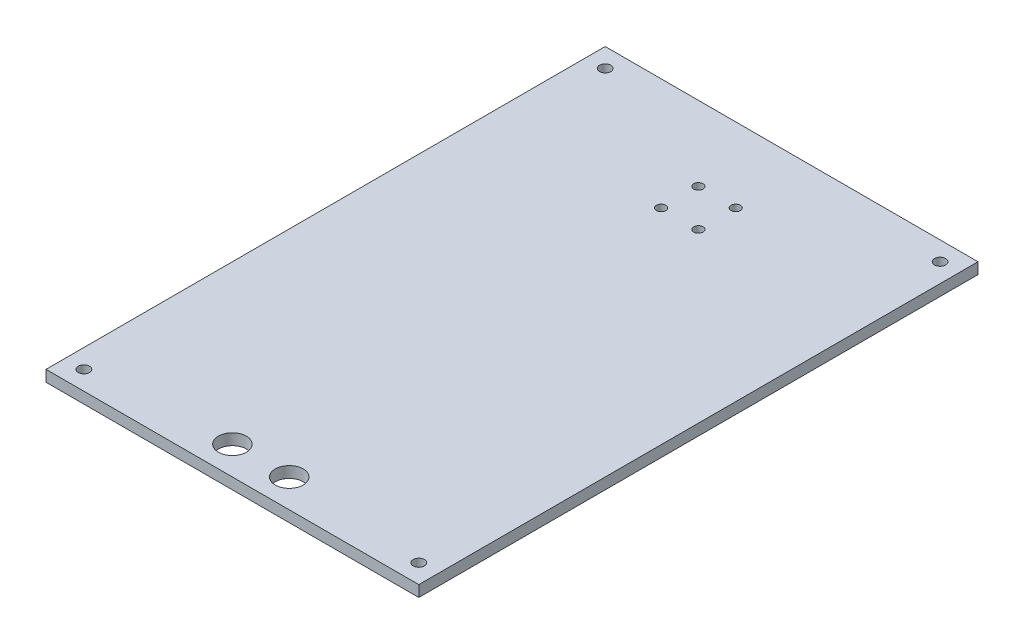
ISO-10303-21;
HEADER;
FILE_DESCRIPTION(('STEP AP214'),'2;1');
FILE_NAME('part.step','',(''),(''),'','','');
FILE_SCHEMA(('AUTOMOTIVE_DESIGN { 1 0 10303 214 1 1 1 1 }'));
ENDSEC;
DATA;
#1=APPLICATION_CONTEXT('core data for automotive mechanical design processes');
#2=APPLICATION_PROTOCOL_DEFINITION('international standard','automotive_design',2000,#1);
#3=PRODUCT_CONTEXT('',#1,'mechanical');
#4=PRODUCT('Part','Part','',(#3));
#5=PRODUCT_RELATED_PRODUCT_CATEGORY('part','',(#4));
#6=PRODUCT_DEFINITION_FORMATION('','',#4);
#7=PRODUCT_DEFINITION_CONTEXT('part definition',#1,'design');
#8=PRODUCT_DEFINITION('design','',#6,#7);
#9=PRODUCT_DEFINITION_SHAPE('','',#8);
#10=(LENGTH_UNIT() NAMED_UNIT(*) SI_UNIT(.MILLI.,.METRE.));
#11=(NAMED_UNIT(*) PLANE_ANGLE_UNIT() SI_UNIT($,.RADIAN.));
#12=(NAMED_UNIT(*) SI_UNIT($,.STERADIAN.) SOLID_ANGLE_UNIT());
#13=UNCERTAINTY_MEASURE_WITH_UNIT(LENGTH_MEASURE(1.E-05),#10,'distance_accuracy_value','');
#14=(GEOMETRIC_REPRESENTATION_CONTEXT(3) GLOBAL_UNCERTAINTY_ASSIGNED_CONTEXT((#13)) GLOBAL_UNIT_ASSIGNED_CONTEXT((#10,
#11,#12)) REPRESENTATION_CONTEXT('',''));
#15=CARTESIAN_POINT('',(0.,0.,0.));
#16=DIRECTION('',(0.,0.,1.));
#17=DIRECTION('',(1.,0.,0.));
#18=AXIS2_PLACEMENT_3D('',#15,#16,#17);
#19=CARTESIAN_POINT('',(49.999999949,3.,74.999999987));
#20=DIRECTION('',(-1.,0.,0.));
#21=DIRECTION('',(0.,0.,1.));
#22=AXIS2_PLACEMENT_3D('',#19,#20,#21);
#23=PLANE('',#22);
#24=DIRECTION('',(0.,0.,-1.));
#25=VECTOR('',#24,1.);
#26=CARTESIAN_POINT('',(49.999999949,0.,74.999999987));
#27=LINE('',#26,#25);
#28=CARTESIAN_POINT('',(49.999999949,0.,74.999999987));
#29=VERTEX_POINT('',#28);
#30=CARTESIAN_POINT('',(49.999999949,0.,-74.999999987));
#31=VERTEX_POINT('',#30);
#32=EDGE_CURVE('E96',#29,#31,#27,.T.);
#33=ORIENTED_EDGE('',*,*,#32,.T.);
#34=DIRECTION('',(0.,-1.,0.));
#35=VECTOR('',#34,1.);
#36=CARTESIAN_POINT('',(49.999999949,3.,-74.999999987));
#37=LINE('',#36,#35);
#38=CARTESIAN_POINT('',(49.999999949,3.,-74.999999987));
#39=VERTEX_POINT('',#38);
#40=EDGE_CURVE('E11',#39,#31,#37,.T.);
#41=ORIENTED_EDGE('',*,*,#40,.F.);
#42=DIRECTION('',(0.,0.,-1.));
#43=VECTOR('',#42,1.);
#44=CARTESIAN_POINT('',(49.999999949,3.,74.999999987));
#45=LINE('',#44,#43);
#46=CARTESIAN_POINT('',(49.999999949,3.,74.999999987));
#47=VERTEX_POINT('',#46);
#48=EDGE_CURVE('E84',#47,#39,#45,.T.);
#49=ORIENTED_EDGE('',*,*,#48,.F.);
#50=DIRECTION('',(0.,-1.,0.));
#51=VECTOR('',#50,1.);
#52=CARTESIAN_POINT('',(49.999999949,3.,74.999999987));
#53=LINE('',#52,#51);
#54=EDGE_CURVE('E92',#47,#29,#53,.T.);
#55=ORIENTED_EDGE('',*,*,#54,.T.);
#56=EDGE_LOOP('',(#33,#41,#49,#55));
#57=FACE_BOUND('',#56,.T.);
#58=ADVANCED_FACE('F33',(#57),#23,.F.);
#59=CARTESIAN_POINT('',(-49.999999949,3.,-74.999999987));
#60=DIRECTION('',(0.,0.,1.));
#61=DIRECTION('',(1.,0.,0.));
#62=AXIS2_PLACEMENT_3D('',#59,#60,#61);
#63=PLANE('',#62);
#64=DIRECTION('',(-1.,0.,0.));
#65=VECTOR('',#64,1.);
#66=CARTESIAN_POINT('',(-49.999999949,0.,-74.999999987));
#67=LINE('',#66,#65);
#68=CARTESIAN_POINT('',(-49.999999949,0.,-74.999999987));
#69=VERTEX_POINT('',#68);
#70=EDGE_CURVE('E88',#31,#69,#67,.T.);
#71=ORIENTED_EDGE('',*,*,#70,.T.);
#72=DIRECTION('',(0.,-1.,0.));
#73=VECTOR('',#72,1.);
#74=CARTESIAN_POINT('',(-49.999999949,3.,-74.999999987));
#75=LINE('',#74,#73);
#76=CARTESIAN_POINT('',(-49.999999949,3.,-74.999999987));
#77=VERTEX_POINT('',#76);
#78=EDGE_CURVE('E41',#77,#69,#75,.T.);
#79=ORIENTED_EDGE('',*,*,#78,.F.);
#80=DIRECTION('',(-1.,0.,0.));
#81=VECTOR('',#80,1.);
#82=CARTESIAN_POINT('',(-49.999999949,3.,-74.999999987));
#83=LINE('',#82,#81);
#84=EDGE_CURVE('E79',#39,#77,#83,.T.);
#85=ORIENTED_EDGE('',*,*,#84,.F.);
#86=ORIENTED_EDGE('',*,*,#40,.T.);
#87=EDGE_LOOP('',(#71,#79,#85,#86));
#88=FACE_BOUND('',#87,.T.);
#89=ADVANCED_FACE('F87',(#88),#63,.F.);
#90=CARTESIAN_POINT('',(-49.999999949,3.,74.999999987));
#91=DIRECTION('',(1.,0.,0.));
#92=DIRECTION('',(0.,0.,-1.));
#93=AXIS2_PLACEMENT_3D('',#90,#91,#92);
#94=PLANE('',#93);
#95=DIRECTION('',(0.,0.,1.));
#96=VECTOR('',#95,1.);
#97=CARTESIAN_POINT('',(-49.999999949,0.,74.999999987));
#98=LINE('',#97,#96);
#99=CARTESIAN_POINT('',(-49.999999949,0.,74.999999987));
#100=VERTEX_POINT('',#99);
#101=EDGE_CURVE('E66',#69,#100,#98,.T.);
#102=ORIENTED_EDGE('',*,*,#101,.T.);
#103=DIRECTION('',(0.,-1.,0.));
#104=VECTOR('',#103,1.);
#105=CARTESIAN_POINT('',(-49.999999949,3.,74.999999987));
#106=LINE('',#105,#104);
#107=CARTESIAN_POINT('',(-49.999999949,3.,74.999999987));
#108=VERTEX_POINT('',#107);
#109=EDGE_CURVE('E89',#108,#100,#106,.T.);
#110=ORIENTED_EDGE('',*,*,#109,.F.);
#111=DIRECTION('',(0.,0.,1.));
#112=VECTOR('',#111,1.);
#113=CARTESIAN_POINT('',(-49.999999949,3.,74.999999987));
#114=LINE('',#113,#112);
#115=EDGE_CURVE('E82',#77,#108,#114,.T.);
#116=ORIENTED_EDGE('',*,*,#115,.F.);
#117=ORIENTED_EDGE('',*,*,#78,.T.);
#118=EDGE_LOOP('',(#102,#110,#116,#117));
#119=FACE_BOUND('',#118,.T.);
#120=ADVANCED_FACE('F90',(#119),#94,.F.);
#121=CARTESIAN_POINT('',(-49.999999949,3.,74.999999987));
#122=DIRECTION('',(0.,0.,-1.));
#123=DIRECTION('',(-1.,0.,0.));
#124=AXIS2_PLACEMENT_3D('',#121,#122,#123);
#125=PLANE('',#124);
#126=DIRECTION('',(1.,0.,0.));
#127=VECTOR('',#126,1.);
#128=CARTESIAN_POINT('',(-49.999999949,0.,74.999999987));
#129=LINE('',#128,#127);
#130=EDGE_CURVE('E72',#100,#29,#129,.T.);
#131=ORIENTED_EDGE('',*,*,#130,.T.);
#132=ORIENTED_EDGE('',*,*,#54,.F.);
#133=DIRECTION('',(1.,0.,0.));
#134=VECTOR('',#133,1.);
#135=CARTESIAN_POINT('',(-49.999999949,3.,74.999999987));
#136=LINE('',#135,#134);
#137=EDGE_CURVE('E49',#108,#47,#136,.T.);
#138=ORIENTED_EDGE('',*,*,#137,.F.);
#139=ORIENTED_EDGE('',*,*,#109,.T.);
#140=EDGE_LOOP('',(#131,#132,#138,#139));
#141=FACE_BOUND('',#140,.T.);
#142=ADVANCED_FACE('F104',(#141),#125,.F.);
#143=CARTESIAN_POINT('',(0.,3.,0.));
#144=DIRECTION('',(0.,-1.,0.));
#145=DIRECTION('',(0.,0.,-1.));
#146=AXIS2_PLACEMENT_3D('',#143,#144,#145);
#147=PLANE('',#146);
#148=CARTESIAN_POINT('',(4.999999906,3.,-45.000000109));
#149=DIRECTION('',(0.,1.,0.));
#150=DIRECTION('',(0.,0.,1.));
#151=AXIS2_PLACEMENT_3D('',#148,#149,#150);
#152=CIRCLE('',#151,1.25);
#153=CARTESIAN_POINT('',(4.999999906,3.,-43.750000109));
#154=VERTEX_POINT('',#153);
#155=EDGE_CURVE('E164',#154,#154,#152,.T.);
#156=ORIENTED_EDGE('',*,*,#155,.F.);
#157=EDGE_LOOP('',(#156));
#158=FACE_BOUND('',#157,.T.);
#159=CARTESIAN_POINT('',(-4.999999906,3.,-45.000000109));
#160=DIRECTION('',(0.,1.,0.));
#161=DIRECTION('',(0.,0.,1.));
#162=AXIS2_PLACEMENT_3D('',#159,#160,#161);
#163=CIRCLE('',#162,1.25);
#164=CARTESIAN_POINT('',(-4.999999906,3.,-43.750000109));
#165=VERTEX_POINT('',#164);
#166=EDGE_CURVE('E158',#165,#165,#163,.T.);
#167=ORIENTED_EDGE('',*,*,#166,.F.);
#168=EDGE_LOOP('',(#167));
#169=FACE_BOUND('',#168,.T.);
#170=CARTESIAN_POINT('',(4.999999906,3.,-55.000000109));
#171=DIRECTION('',(0.,1.,0.));
#172=DIRECTION('',(0.,0.,1.));
#173=AXIS2_PLACEMENT_3D('',#170,#171,#172);
#174=CIRCLE('',#173,1.25);
#175=CARTESIAN_POINT('',(4.999999906,3.,-53.750000109));
#176=VERTEX_POINT('',#175);
#177=EDGE_CURVE('E152',#176,#176,#174,.T.);
#178=ORIENTED_EDGE('',*,*,#177,.F.);
#179=EDGE_LOOP('',(#178));
#180=FACE_BOUND('',#179,.T.);
#181=CARTESIAN_POINT('',(-4.999999906,3.,-55.000000109));
#182=DIRECTION('',(0.,1.,0.));
#183=DIRECTION('',(0.,0.,1.));
#184=AXIS2_PLACEMENT_3D('',#181,#182,#183);
#185=CIRCLE('',#184,1.25);
#186=CARTESIAN_POINT('',(-4.999999906,3.,-53.750000109));
#187=VERTEX_POINT('',#186);
#188=EDGE_CURVE('E146',#187,#187,#185,.T.);
#189=ORIENTED_EDGE('',*,*,#188,.F.);
#190=EDGE_LOOP('',(#189));
#191=FACE_BOUND('',#190,.T.);
#192=CARTESIAN_POINT('',(44.919999949,3.,69.919999987));
#193=DIRECTION('',(0.,1.,0.));
#194=DIRECTION('',(0.,0.,1.));
#195=AXIS2_PLACEMENT_3D('',#192,#193,#194);
#196=CIRCLE('',#195,1.5);
#197=CARTESIAN_POINT('',(44.919999949,3.,71.419999987));
#198=VERTEX_POINT('',#197);
#199=EDGE_CURVE('E140',#198,#198,#196,.T.);
#200=ORIENTED_EDGE('',*,*,#199,.F.);
#201=EDGE_LOOP('',(#200));
#202=FACE_BOUND('',#201,.T.);
#203=CARTESIAN_POINT('',(-44.919999949,3.,69.919999987));
#204=DIRECTION('',(0.,1.,0.));
#205=DIRECTION('',(0.,0.,1.));
#206=AXIS2_PLACEMENT_3D('',#203,#204,#205);
#207=CIRCLE('',#206,1.5);
#208=CARTESIAN_POINT('',(-44.919999949,3.,71.419999987));
#209=VERTEX_POINT('',#208);
#210=EDGE_CURVE('E134',#209,#209,#207,.T.);
#211=ORIENTED_EDGE('',*,*,#210,.F.);
#212=EDGE_LOOP('',(#211));
#213=FACE_BOUND('',#212,.T.);
#214=CARTESIAN_POINT('',(44.919999949,3.,-69.919999987));
#215=DIRECTION('',(0.,1.,0.));
#216=DIRECTION('',(0.,0.,1.));
#217=AXIS2_PLACEMENT_3D('',#214,#215,#216);
#218=CIRCLE('',#217,1.5);
#219=CARTESIAN_POINT('',(44.919999949,3.,-68.419999987));
#220=VERTEX_POINT('',#219);
#221=EDGE_CURVE('E128',#220,#220,#218,.T.);
#222=ORIENTED_EDGE('',*,*,#221,.F.);
#223=EDGE_LOOP('',(#222));
#224=FACE_BOUND('',#223,.T.);
#225=CARTESIAN_POINT('',(-44.919999949,3.,-69.919999987));
#226=DIRECTION('',(0.,1.,0.));
#227=DIRECTION('',(0.,0.,1.));
#228=AXIS2_PLACEMENT_3D('',#225,#226,#227);
#229=CIRCLE('',#228,1.500000048);
#230=CARTESIAN_POINT('',(-44.919999949,3.,-68.419999939));
#231=VERTEX_POINT('',#230);
#232=EDGE_CURVE('E122',#231,#231,#229,.T.);
#233=ORIENTED_EDGE('',*,*,#232,.F.);
#234=EDGE_LOOP('',(#233));
#235=FACE_BOUND('',#234,.T.);
#236=CARTESIAN_POINT('',(7.62000000000002,3.,67.379999987));
#237=DIRECTION('',(0.,1.,0.));
#238=DIRECTION('',(0.,0.,1.));
#239=AXIS2_PLACEMENT_3D('',#236,#237,#238);
#240=CIRCLE('',#239,3.749999993);
#241=CARTESIAN_POINT('',(7.62000000000002,3.,71.12999998));
#242=VERTEX_POINT('',#241);
#243=EDGE_CURVE('E116',#242,#242,#240,.T.);
#244=ORIENTED_EDGE('',*,*,#243,.F.);
#245=EDGE_LOOP('',(#244));
#246=FACE_BOUND('',#245,.T.);
#247=CARTESIAN_POINT('',(-7.61999999999998,3.,67.379999987));
#248=DIRECTION('',(0.,1.,0.));
#249=DIRECTION('',(0.,0.,1.));
#250=AXIS2_PLACEMENT_3D('',#247,#248,#249);
#251=CIRCLE('',#250,3.749999993);
#252=CARTESIAN_POINT('',(-7.61999999999998,3.,71.12999998));
#253=VERTEX_POINT('',#252);
#254=EDGE_CURVE('E110',#253,#253,#251,.T.);
#255=ORIENTED_EDGE('',*,*,#254,.F.);
#256=EDGE_LOOP('',(#255));
#257=FACE_BOUND('',#256,.T.);
#258=ORIENTED_EDGE('',*,*,#48,.T.);
#259=ORIENTED_EDGE('',*,*,#84,.T.);
#260=ORIENTED_EDGE('',*,*,#115,.T.);
#261=ORIENTED_EDGE('',*,*,#137,.T.);
#262=EDGE_LOOP('',(#258,#259,#260,#261));
#263=FACE_BOUND('',#262,.T.);
#264=ADVANCED_FACE('F80',(#158,#169,#180,#191,#202,#213,#224,#235,#246,#257,#263),#147,.F.);
#265=CARTESIAN_POINT('',(0.,0.,0.));
#266=DIRECTION('',(0.,-1.,0.));
#267=DIRECTION('',(0.,0.,-1.));
#268=AXIS2_PLACEMENT_3D('',#265,#266,#267);
#269=PLANE('',#268);
#270=CARTESIAN_POINT('',(4.999999906,0.,-45.000000109));
#271=DIRECTION('',(0.,1.,0.));
#272=DIRECTION('',(0.,0.,1.));
#273=AXIS2_PLACEMENT_3D('',#270,#271,#272);
#274=CIRCLE('',#273,1.25);
#275=CARTESIAN_POINT('',(4.999999906,0.,-43.750000109));
#276=VERTEX_POINT('',#275);
#277=EDGE_CURVE('E161',#276,#276,#274,.T.);
#278=ORIENTED_EDGE('',*,*,#277,.T.);
#279=EDGE_LOOP('',(#278));
#280=FACE_BOUND('',#279,.T.);
#281=CARTESIAN_POINT('',(-4.999999906,0.,-45.000000109));
#282=DIRECTION('',(0.,1.,0.));
#283=DIRECTION('',(0.,0.,1.));
#284=AXIS2_PLACEMENT_3D('',#281,#282,#283);
#285=CIRCLE('',#284,1.25);
#286=CARTESIAN_POINT('',(-4.999999906,0.,-43.750000109));
#287=VERTEX_POINT('',#286);
#288=EDGE_CURVE('E155',#287,#287,#285,.T.);
#289=ORIENTED_EDGE('',*,*,#288,.T.);
#290=EDGE_LOOP('',(#289));
#291=FACE_BOUND('',#290,.T.);
#292=CARTESIAN_POINT('',(4.999999906,0.,-55.000000109));
#293=DIRECTION('',(0.,1.,0.));
#294=DIRECTION('',(0.,0.,1.));
#295=AXIS2_PLACEMENT_3D('',#292,#293,#294);
#296=CIRCLE('',#295,1.25);
#297=CARTESIAN_POINT('',(4.999999906,0.,-53.750000109));
#298=VERTEX_POINT('',#297);
#299=EDGE_CURVE('E149',#298,#298,#296,.T.);
#300=ORIENTED_EDGE('',*,*,#299,.T.);
#301=EDGE_LOOP('',(#300));
#302=FACE_BOUND('',#301,.T.);
#303=CARTESIAN_POINT('',(-4.999999906,0.,-55.000000109));
#304=DIRECTION('',(0.,1.,0.));
#305=DIRECTION('',(0.,0.,1.));
#306=AXIS2_PLACEMENT_3D('',#303,#304,#305);
#307=CIRCLE('',#306,1.25);
#308=CARTESIAN_POINT('',(-4.999999906,0.,-53.750000109));
#309=VERTEX_POINT('',#308);
#310=EDGE_CURVE('E143',#309,#309,#307,.T.);
#311=ORIENTED_EDGE('',*,*,#310,.T.);
#312=EDGE_LOOP('',(#311));
#313=FACE_BOUND('',#312,.T.);
#314=CARTESIAN_POINT('',(44.919999949,0.,69.919999987));
#315=DIRECTION('',(0.,1.,0.));
#316=DIRECTION('',(0.,0.,1.));
#317=AXIS2_PLACEMENT_3D('',#314,#315,#316);
#318=CIRCLE('',#317,1.5);
#319=CARTESIAN_POINT('',(44.919999949,0.,71.419999987));
#320=VERTEX_POINT('',#319);
#321=EDGE_CURVE('E137',#320,#320,#318,.T.);
#322=ORIENTED_EDGE('',*,*,#321,.T.);
#323=EDGE_LOOP('',(#322));
#324=FACE_BOUND('',#323,.T.);
#325=CARTESIAN_POINT('',(-44.919999949,0.,69.919999987));
#326=DIRECTION('',(0.,1.,0.));
#327=DIRECTION('',(0.,0.,1.));
#328=AXIS2_PLACEMENT_3D('',#325,#326,#327);
#329=CIRCLE('',#328,1.5);
#330=CARTESIAN_POINT('',(-44.919999949,0.,71.419999987));
#331=VERTEX_POINT('',#330);
#332=EDGE_CURVE('E131',#331,#331,#329,.T.);
#333=ORIENTED_EDGE('',*,*,#332,.T.);
#334=EDGE_LOOP('',(#333));
#335=FACE_BOUND('',#334,.T.);
#336=CARTESIAN_POINT('',(44.919999949,0.,-69.919999987));
#337=DIRECTION('',(0.,1.,0.));
#338=DIRECTION('',(0.,0.,1.));
#339=AXIS2_PLACEMENT_3D('',#336,#337,#338);
#340=CIRCLE('',#339,1.5);
#341=CARTESIAN_POINT('',(44.919999949,0.,-68.419999987));
#342=VERTEX_POINT('',#341);
#343=EDGE_CURVE('E125',#342,#342,#340,.T.);
#344=ORIENTED_EDGE('',*,*,#343,.T.);
#345=EDGE_LOOP('',(#344));
#346=FACE_BOUND('',#345,.T.);
#347=CARTESIAN_POINT('',(-44.919999949,0.,-69.919999987));
#348=DIRECTION('',(0.,1.,0.));
#349=DIRECTION('',(0.,0.,1.));
#350=AXIS2_PLACEMENT_3D('',#347,#348,#349);
#351=CIRCLE('',#350,1.500000048);
#352=CARTESIAN_POINT('',(-44.919999949,0.,-68.419999939));
#353=VERTEX_POINT('',#352);
#354=EDGE_CURVE('E119',#353,#353,#351,.T.);
#355=ORIENTED_EDGE('',*,*,#354,.T.);
#356=EDGE_LOOP('',(#355));
#357=FACE_BOUND('',#356,.T.);
#358=CARTESIAN_POINT('',(7.62000000000002,0.,67.379999987));
#359=DIRECTION('',(0.,1.,0.));
#360=DIRECTION('',(0.,0.,1.));
#361=AXIS2_PLACEMENT_3D('',#358,#359,#360);
#362=CIRCLE('',#361,3.749999993);
#363=CARTESIAN_POINT('',(7.62000000000002,0.,71.12999998));
#364=VERTEX_POINT('',#363);
#365=EDGE_CURVE('E113',#364,#364,#362,.T.);
#366=ORIENTED_EDGE('',*,*,#365,.T.);
#367=EDGE_LOOP('',(#366));
#368=FACE_BOUND('',#367,.T.);
#369=CARTESIAN_POINT('',(-7.61999999999998,0.,67.379999987));
#370=DIRECTION('',(0.,1.,0.));
#371=DIRECTION('',(0.,0.,1.));
#372=AXIS2_PLACEMENT_3D('',#369,#370,#371);
#373=CIRCLE('',#372,3.749999993);
#374=CARTESIAN_POINT('',(-7.61999999999998,0.,71.12999998));
#375=VERTEX_POINT('',#374);
#376=EDGE_CURVE('E99',#375,#375,#373,.T.);
#377=ORIENTED_EDGE('',*,*,#376,.T.);
#378=EDGE_LOOP('',(#377));
#379=FACE_BOUND('',#378,.T.);
#380=ORIENTED_EDGE('',*,*,#32,.F.);
#381=ORIENTED_EDGE('',*,*,#130,.F.);
#382=ORIENTED_EDGE('',*,*,#101,.F.);
#383=ORIENTED_EDGE('',*,*,#70,.F.);
#384=EDGE_LOOP('',(#380,#381,#382,#383));
#385=FACE_BOUND('',#384,.T.);
#386=ADVANCED_FACE('F107',(#280,#291,#302,#313,#324,#335,#346,#357,#368,#379,#385),#269,.T.);
#387=CARTESIAN_POINT('',(-7.61999999999998,0.,67.379999987));
#388=DIRECTION('',(0.,1.,0.));
#389=DIRECTION('',(0.,0.,1.));
#390=AXIS2_PLACEMENT_3D('',#387,#388,#389);
#391=CYLINDRICAL_SURFACE('',#390,3.749999993);
#392=ORIENTED_EDGE('',*,*,#376,.F.);
#393=EDGE_LOOP('',(#392));
#394=FACE_BOUND('',#393,.T.);
#395=ORIENTED_EDGE('',*,*,#254,.T.);
#396=EDGE_LOOP('',(#395));
#397=FACE_BOUND('',#396,.T.);
#398=ADVANCED_FACE('F200',(#394,#397),#391,.F.);
#399=CARTESIAN_POINT('',(7.62000000000002,0.,67.379999987));
#400=DIRECTION('',(0.,1.,0.));
#401=DIRECTION('',(0.,0.,1.));
#402=AXIS2_PLACEMENT_3D('',#399,#400,#401);
#403=CYLINDRICAL_SURFACE('',#402,3.749999993);
#404=ORIENTED_EDGE('',*,*,#365,.F.);
#405=EDGE_LOOP('',(#404));
#406=FACE_BOUND('',#405,.T.);
#407=ORIENTED_EDGE('',*,*,#243,.T.);
#408=EDGE_LOOP('',(#407));
#409=FACE_BOUND('',#408,.T.);
#410=ADVANCED_FACE('F202',(#406,#409),#403,.F.);
#411=CARTESIAN_POINT('',(-44.919999949,0.,-69.919999987));
#412=DIRECTION('',(0.,1.,0.));
#413=DIRECTION('',(0.,0.,1.));
#414=AXIS2_PLACEMENT_3D('',#411,#412,#413);
#415=CYLINDRICAL_SURFACE('',#414,1.500000048);
#416=ORIENTED_EDGE('',*,*,#354,.F.);
#417=EDGE_LOOP('',(#416));
#418=FACE_BOUND('',#417,.T.);
#419=ORIENTED_EDGE('',*,*,#232,.T.);
#420=EDGE_LOOP('',(#419));
#421=FACE_BOUND('',#420,.T.);
#422=ADVANCED_FACE('F209',(#418,#421),#415,.F.);
#423=CARTESIAN_POINT('',(44.919999949,0.,-69.919999987));
#424=DIRECTION('',(0.,1.,0.));
#425=DIRECTION('',(0.,0.,1.));
#426=AXIS2_PLACEMENT_3D('',#423,#424,#425);
#427=CYLINDRICAL_SURFACE('',#426,1.5);
#428=ORIENTED_EDGE('',*,*,#343,.F.);
#429=EDGE_LOOP('',(#428));
#430=FACE_BOUND('',#429,.T.);
#431=ORIENTED_EDGE('',*,*,#221,.T.);
#432=EDGE_LOOP('',(#431));
#433=FACE_BOUND('',#432,.T.);
#434=ADVANCED_FACE('F255',(#430,#433),#427,.F.);
#435=CARTESIAN_POINT('',(-44.919999949,0.,69.919999987));
#436=DIRECTION('',(0.,1.,0.));
#437=DIRECTION('',(0.,0.,1.));
#438=AXIS2_PLACEMENT_3D('',#435,#436,#437);
#439=CYLINDRICAL_SURFACE('',#438,1.5);
#440=ORIENTED_EDGE('',*,*,#332,.F.);
#441=EDGE_LOOP('',(#440));
#442=FACE_BOUND('',#441,.T.);
#443=ORIENTED_EDGE('',*,*,#210,.T.);
#444=EDGE_LOOP('',(#443));
#445=FACE_BOUND('',#444,.T.);
#446=ADVANCED_FACE('F265',(#442,#445),#439,.F.);
#447=CARTESIAN_POINT('',(44.919999949,0.,69.919999987));
#448=DIRECTION('',(0.,1.,0.));
#449=DIRECTION('',(0.,0.,1.));
#450=AXIS2_PLACEMENT_3D('',#447,#448,#449);
#451=CYLINDRICAL_SURFACE('',#450,1.5);
#452=ORIENTED_EDGE('',*,*,#321,.F.);
#453=EDGE_LOOP('',(#452));
#454=FACE_BOUND('',#453,.T.);
#455=ORIENTED_EDGE('',*,*,#199,.T.);
#456=EDGE_LOOP('',(#455));
#457=FACE_BOUND('',#456,.T.);
#458=ADVANCED_FACE('F275',(#454,#457),#451,.F.);
#459=CARTESIAN_POINT('',(-4.999999906,0.,-55.000000109));
#460=DIRECTION('',(0.,1.,0.));
#461=DIRECTION('',(0.,0.,1.));
#462=AXIS2_PLACEMENT_3D('',#459,#460,#461);
#463=CYLINDRICAL_SURFACE('',#462,1.25);
#464=ORIENTED_EDGE('',*,*,#310,.F.);
#465=EDGE_LOOP('',(#464));
#466=FACE_BOUND('',#465,.T.);
#467=ORIENTED_EDGE('',*,*,#188,.T.);
#468=EDGE_LOOP('',(#467));
#469=FACE_BOUND('',#468,.T.);
#470=ADVANCED_FACE('F285',(#466,#469),#463,.F.);
#471=CARTESIAN_POINT('',(4.999999906,0.,-55.000000109));
#472=DIRECTION('',(0.,1.,0.));
#473=DIRECTION('',(0.,0.,1.));
#474=AXIS2_PLACEMENT_3D('',#471,#472,#473);
#475=CYLINDRICAL_SURFACE('',#474,1.25);
#476=ORIENTED_EDGE('',*,*,#299,.F.);
#477=EDGE_LOOP('',(#476));
#478=FACE_BOUND('',#477,.T.);
#479=ORIENTED_EDGE('',*,*,#177,.T.);
#480=EDGE_LOOP('',(#479));
#481=FACE_BOUND('',#480,.T.);
#482=ADVANCED_FACE('F295',(#478,#481),#475,.F.);
#483=CARTESIAN_POINT('',(-4.999999906,0.,-45.000000109));
#484=DIRECTION('',(0.,1.,0.));
#485=DIRECTION('',(0.,0.,1.));
#486=AXIS2_PLACEMENT_3D('',#483,#484,#485);
#487=CYLINDRICAL_SURFACE('',#486,1.25);
#488=ORIENTED_EDGE('',*,*,#288,.F.);
#489=EDGE_LOOP('',(#488));
#490=FACE_BOUND('',#489,.T.);
#491=ORIENTED_EDGE('',*,*,#166,.T.);
#492=EDGE_LOOP('',(#491));
#493=FACE_BOUND('',#492,.T.);
#494=ADVANCED_FACE('F175',(#490,#493),#487,.F.);
#495=CARTESIAN_POINT('',(4.999999906,0.,-45.000000109));
#496=DIRECTION('',(0.,1.,0.));
#497=DIRECTION('',(0.,0.,1.));
#498=AXIS2_PLACEMENT_3D('',#495,#496,#497);
#499=CYLINDRICAL_SURFACE('',#498,1.25);
#500=ORIENTED_EDGE('',*,*,#277,.F.);
#501=EDGE_LOOP('',(#500));
#502=FACE_BOUND('',#501,.T.);
#503=ORIENTED_EDGE('',*,*,#155,.T.);
#504=EDGE_LOOP('',(#503));
#505=FACE_BOUND('',#504,.T.);
#506=ADVANCED_FACE('F172',(#502,#505),#499,.F.);
#507=CLOSED_SHELL('',(#58,#89,#120,#142,#264,#386,#398,#410,#422,#434,#446,#458,#470,#482,#494,#506));
#508=MANIFOLD_SOLID_BREP('B2',#507);
#509=ADVANCED_BREP_SHAPE_REPRESENTATION('',(#18,#508),#14);
#510=SHAPE_DEFINITION_REPRESENTATION(#9,#509);
ENDSEC;
END-ISO-10303-21;
